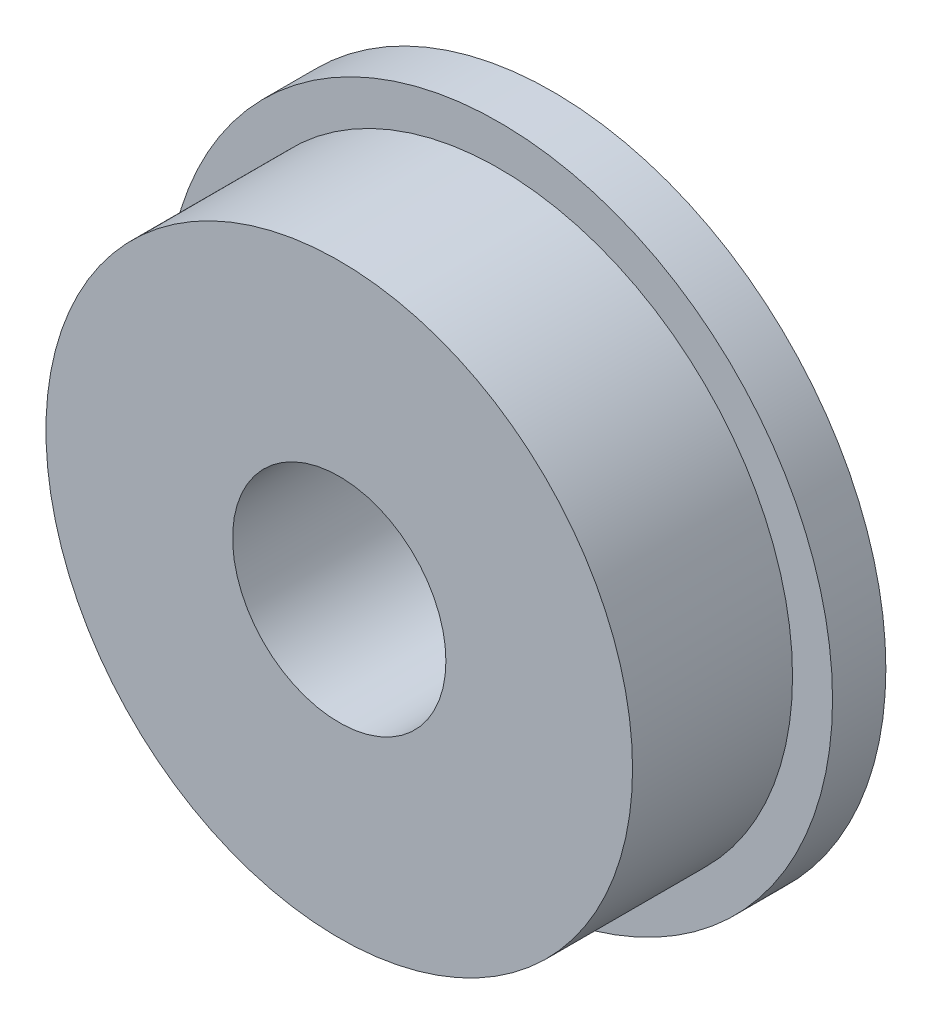
ISO-10303-21;
HEADER;
FILE_DESCRIPTION(('STEP AP214'),'2;1');
FILE_NAME('part.step','',(''),(''),'','','');
FILE_SCHEMA(('AUTOMOTIVE_DESIGN { 1 0 10303 214 1 1 1 1 }'));
ENDSEC;
DATA;
#1=APPLICATION_CONTEXT('core data for automotive mechanical design processes');
#2=APPLICATION_PROTOCOL_DEFINITION('international standard','automotive_design',2000,#1);
#3=PRODUCT_CONTEXT('',#1,'mechanical');
#4=PRODUCT('Part','Part','',(#3));
#5=PRODUCT_RELATED_PRODUCT_CATEGORY('part','',(#4));
#6=PRODUCT_DEFINITION_FORMATION('','',#4);
#7=PRODUCT_DEFINITION_CONTEXT('part definition',#1,'design');
#8=PRODUCT_DEFINITION('design','',#6,#7);
#9=PRODUCT_DEFINITION_SHAPE('','',#8);
#10=(LENGTH_UNIT() NAMED_UNIT(*) SI_UNIT(.MILLI.,.METRE.));
#11=(NAMED_UNIT(*) PLANE_ANGLE_UNIT() SI_UNIT($,.RADIAN.));
#12=(NAMED_UNIT(*) SI_UNIT($,.STERADIAN.) SOLID_ANGLE_UNIT());
#13=UNCERTAINTY_MEASURE_WITH_UNIT(LENGTH_MEASURE(1.E-05),#10,'distance_accuracy_value','');
#14=(GEOMETRIC_REPRESENTATION_CONTEXT(3) GLOBAL_UNCERTAINTY_ASSIGNED_CONTEXT((#13)) GLOBAL_UNIT_ASSIGNED_CONTEXT((#10,
#11,#12)) REPRESENTATION_CONTEXT('',''));
#15=CARTESIAN_POINT('',(0.,0.,0.));
#16=DIRECTION('',(0.,0.,1.));
#17=DIRECTION('',(1.,0.,0.));
#18=AXIS2_PLACEMENT_3D('',#15,#16,#17);
#19=CARTESIAN_POINT('',(0.,0.,4.));
#20=DIRECTION('',(0.,0.,1.));
#21=DIRECTION('',(1.,0.,0.));
#22=AXIS2_PLACEMENT_3D('',#19,#20,#21);
#23=PLANE('',#22);
#24=CARTESIAN_POINT('',(0.,0.,4.));
#25=DIRECTION('',(0.,0.,1.));
#26=DIRECTION('',(1.,0.,0.));
#27=AXIS2_PLACEMENT_3D('',#24,#25,#26);
#28=CIRCLE('',#27,2.);
#29=CARTESIAN_POINT('',(2.,0.,4.));
#30=VERTEX_POINT('',#29);
#31=EDGE_CURVE('E45',#30,#30,#28,.T.);
#32=ORIENTED_EDGE('',*,*,#31,.F.);
#33=EDGE_LOOP('',(#32));
#34=FACE_BOUND('',#33,.T.);
#35=CARTESIAN_POINT('',(0.,0.,4.));
#36=DIRECTION('',(0.,0.,1.));
#37=DIRECTION('',(1.,0.,0.));
#38=AXIS2_PLACEMENT_3D('',#35,#36,#37);
#39=CIRCLE('',#38,5.5);
#40=CARTESIAN_POINT('',(5.5,0.,4.));
#41=VERTEX_POINT('',#40);
#42=EDGE_CURVE('E62',#41,#41,#39,.T.);
#43=ORIENTED_EDGE('',*,*,#42,.T.);
#44=EDGE_LOOP('',(#43));
#45=FACE_BOUND('',#44,.T.);
#46=ADVANCED_FACE('F37',(#34,#45),#23,.T.);
#47=CARTESIAN_POINT('',(0.,0.,4.));
#48=DIRECTION('',(0.,0.,-1.));
#49=DIRECTION('',(-1.,0.,0.));
#50=AXIS2_PLACEMENT_3D('',#47,#48,#49);
#51=CYLINDRICAL_SURFACE('',#50,6.25);
#52=CARTESIAN_POINT('',(0.,0.,0.));
#53=DIRECTION('',(0.,0.,1.));
#54=DIRECTION('',(1.,0.,0.));
#55=AXIS2_PLACEMENT_3D('',#52,#53,#54);
#56=CIRCLE('',#55,6.25);
#57=CARTESIAN_POINT('',(6.25,0.,0.));
#58=VERTEX_POINT('',#57);
#59=EDGE_CURVE('E10',#58,#58,#56,.T.);
#60=ORIENTED_EDGE('',*,*,#59,.T.);
#61=EDGE_LOOP('',(#60));
#62=FACE_BOUND('',#61,.T.);
#63=CARTESIAN_POINT('',(0.,0.,1.));
#64=DIRECTION('',(0.,0.,1.));
#65=DIRECTION('',(1.,0.,0.));
#66=AXIS2_PLACEMENT_3D('',#63,#64,#65);
#67=CIRCLE('',#66,6.25);
#68=CARTESIAN_POINT('',(6.25,0.,1.));
#69=VERTEX_POINT('',#68);
#70=EDGE_CURVE('E56',#69,#69,#67,.T.);
#71=ORIENTED_EDGE('',*,*,#70,.F.);
#72=EDGE_LOOP('',(#71));
#73=FACE_BOUND('',#72,.T.);
#74=ADVANCED_FACE('F39',(#62,#73),#51,.T.);
#75=CARTESIAN_POINT('',(0.,0.,0.));
#76=DIRECTION('',(0.,0.,1.));
#77=DIRECTION('',(1.,0.,0.));
#78=AXIS2_PLACEMENT_3D('',#75,#76,#77);
#79=PLANE('',#78);
#80=ORIENTED_EDGE('',*,*,#59,.F.);
#81=EDGE_LOOP('',(#80));
#82=FACE_BOUND('',#81,.T.);
#83=CARTESIAN_POINT('',(0.,0.,0.));
#84=DIRECTION('',(0.,0.,1.));
#85=DIRECTION('',(1.,0.,0.));
#86=AXIS2_PLACEMENT_3D('',#83,#84,#85);
#87=CIRCLE('',#86,2.);
#88=CARTESIAN_POINT('',(2.,0.,0.));
#89=VERTEX_POINT('',#88);
#90=EDGE_CURVE('E50',#89,#89,#87,.T.);
#91=ORIENTED_EDGE('',*,*,#90,.T.);
#92=EDGE_LOOP('',(#91));
#93=FACE_BOUND('',#92,.T.);
#94=ADVANCED_FACE('F81',(#82,#93),#79,.F.);
#95=CARTESIAN_POINT('',(0.,0.,4.));
#96=DIRECTION('',(0.,0.,-1.));
#97=DIRECTION('',(-1.,0.,0.));
#98=AXIS2_PLACEMENT_3D('',#95,#96,#97);
#99=CYLINDRICAL_SURFACE('',#98,2.);
#100=ORIENTED_EDGE('',*,*,#31,.T.);
#101=EDGE_LOOP('',(#100));
#102=FACE_BOUND('',#101,.T.);
#103=ORIENTED_EDGE('',*,*,#90,.F.);
#104=EDGE_LOOP('',(#103));
#105=FACE_BOUND('',#104,.T.);
#106=ADVANCED_FACE('F76',(#102,#105),#99,.F.);
#107=CARTESIAN_POINT('',(0.,0.,1.));
#108=DIRECTION('',(0.,0.,1.));
#109=DIRECTION('',(1.,0.,0.));
#110=AXIS2_PLACEMENT_3D('',#107,#108,#109);
#111=PLANE('',#110);
#112=CARTESIAN_POINT('',(0.,0.,1.));
#113=DIRECTION('',(0.,0.,1.));
#114=DIRECTION('',(1.,0.,0.));
#115=AXIS2_PLACEMENT_3D('',#112,#113,#114);
#116=CIRCLE('',#115,5.5);
#117=CARTESIAN_POINT('',(5.5,0.,1.));
#118=VERTEX_POINT('',#117);
#119=EDGE_CURVE('E61',#118,#118,#116,.T.);
#120=ORIENTED_EDGE('',*,*,#119,.F.);
#121=EDGE_LOOP('',(#120));
#122=FACE_BOUND('',#121,.T.);
#123=ORIENTED_EDGE('',*,*,#70,.T.);
#124=EDGE_LOOP('',(#123));
#125=FACE_BOUND('',#124,.T.);
#126=ADVANCED_FACE('F73',(#122,#125),#111,.T.);
#127=CARTESIAN_POINT('',(0.,0.,1.));
#128=DIRECTION('',(0.,0.,1.));
#129=DIRECTION('',(1.,0.,0.));
#130=AXIS2_PLACEMENT_3D('',#127,#128,#129);
#131=CYLINDRICAL_SURFACE('',#130,5.5);
#132=ORIENTED_EDGE('',*,*,#119,.T.);
#133=EDGE_LOOP('',(#132));
#134=FACE_BOUND('',#133,.T.);
#135=ORIENTED_EDGE('',*,*,#42,.F.);
#136=EDGE_LOOP('',(#135));
#137=FACE_BOUND('',#136,.T.);
#138=ADVANCED_FACE('F70',(#134,#137),#131,.T.);
#139=CLOSED_SHELL('',(#46,#74,#94,#106,#126,#138));
#140=MANIFOLD_SOLID_BREP('B2',#139);
#141=ADVANCED_BREP_SHAPE_REPRESENTATION('',(#18,#140),#14);
#142=SHAPE_DEFINITION_REPRESENTATION(#9,#141);
ENDSEC;
END-ISO-10303-21;
